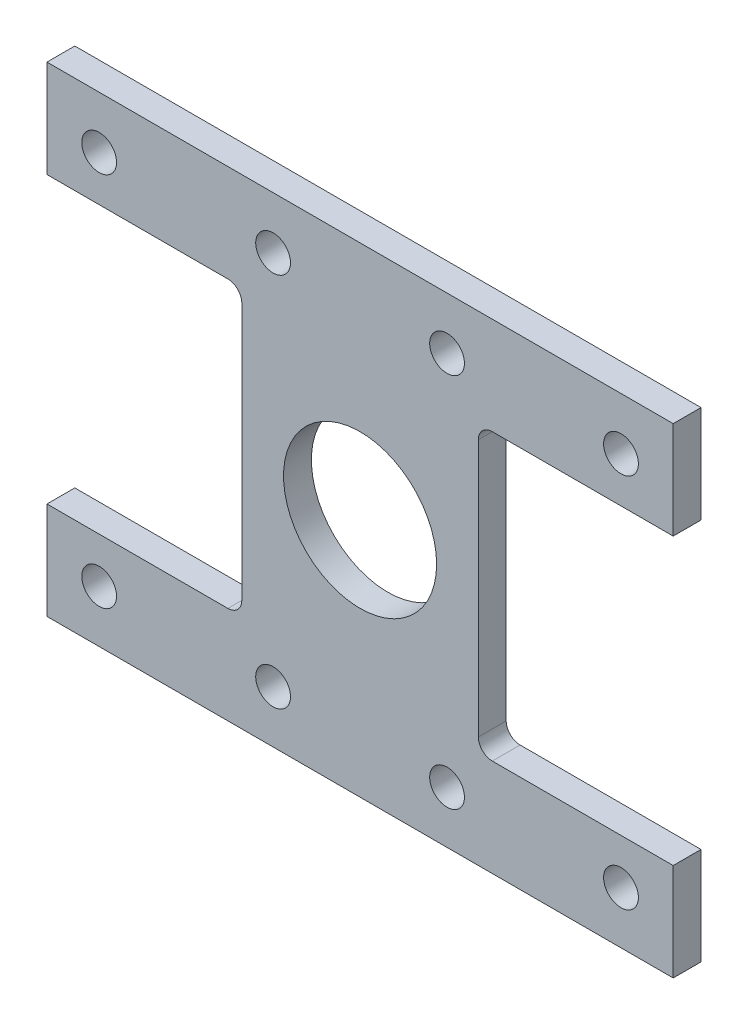
ISO-10303-21;
HEADER;
FILE_DESCRIPTION(('STEP AP214'),'2;1');
FILE_NAME('part.step','',(''),(''),'','','');
FILE_SCHEMA(('AUTOMOTIVE_DESIGN { 1 0 10303 214 1 1 1 1 }'));
ENDSEC;
DATA;
#1=APPLICATION_CONTEXT('core data for automotive mechanical design processes');
#2=APPLICATION_PROTOCOL_DEFINITION('international standard','automotive_design',2000,#1);
#3=PRODUCT_CONTEXT('',#1,'mechanical');
#4=PRODUCT('Part','Part','',(#3));
#5=PRODUCT_RELATED_PRODUCT_CATEGORY('part','',(#4));
#6=PRODUCT_DEFINITION_FORMATION('','',#4);
#7=PRODUCT_DEFINITION_CONTEXT('part definition',#1,'design');
#8=PRODUCT_DEFINITION('design','',#6,#7);
#9=PRODUCT_DEFINITION_SHAPE('','',#8);
#10=(LENGTH_UNIT() NAMED_UNIT(*) SI_UNIT(.MILLI.,.METRE.));
#11=(NAMED_UNIT(*) PLANE_ANGLE_UNIT() SI_UNIT($,.RADIAN.));
#12=(NAMED_UNIT(*) SI_UNIT($,.STERADIAN.) SOLID_ANGLE_UNIT());
#13=UNCERTAINTY_MEASURE_WITH_UNIT(LENGTH_MEASURE(1.E-05),#10,'distance_accuracy_value','');
#14=(GEOMETRIC_REPRESENTATION_CONTEXT(3) GLOBAL_UNCERTAINTY_ASSIGNED_CONTEXT((#13)) GLOBAL_UNIT_ASSIGNED_CONTEXT((#10,
#11,#12)) REPRESENTATION_CONTEXT('',''));
#15=CARTESIAN_POINT('',(0.,0.,0.));
#16=DIRECTION('',(0.,0.,1.));
#17=DIRECTION('',(1.,0.,0.));
#18=AXIS2_PLACEMENT_3D('',#15,#16,#17);
#19=CARTESIAN_POINT('',(45.,0.,4.));
#20=DIRECTION('',(-1.,0.,0.));
#21=DIRECTION('',(0.,0.,1.));
#22=AXIS2_PLACEMENT_3D('',#19,#20,#21);
#23=PLANE('',#22);
#24=DIRECTION('',(0.,1.,0.));
#25=VECTOR('',#24,1.);
#26=CARTESIAN_POINT('',(45.,0.,0.));
#27=LINE('',#26,#25);
#28=CARTESIAN_POINT('',(45.,0.,0.));
#29=VERTEX_POINT('',#28);
#30=CARTESIAN_POINT('',(45.,14.,0.));
#31=VERTEX_POINT('',#30);
#32=EDGE_CURVE('E179',#29,#31,#27,.T.);
#33=ORIENTED_EDGE('',*,*,#32,.T.);
#34=DIRECTION('',(0.,0.,-1.));
#35=VECTOR('',#34,1.);
#36=CARTESIAN_POINT('',(45.,14.,4.));
#37=LINE('',#36,#35);
#38=CARTESIAN_POINT('',(45.,14.,4.));
#39=VERTEX_POINT('',#38);
#40=EDGE_CURVE('E159',#39,#31,#37,.T.);
#41=ORIENTED_EDGE('',*,*,#40,.F.);
#42=DIRECTION('',(0.,1.,0.));
#43=VECTOR('',#42,1.);
#44=CARTESIAN_POINT('',(45.,0.,4.));
#45=LINE('',#44,#43);
#46=CARTESIAN_POINT('',(45.,0.,4.));
#47=VERTEX_POINT('',#46);
#48=EDGE_CURVE('E166',#47,#39,#45,.T.);
#49=ORIENTED_EDGE('',*,*,#48,.F.);
#50=DIRECTION('',(0.,0.,-1.));
#51=VECTOR('',#50,1.);
#52=CARTESIAN_POINT('',(45.,0.,4.));
#53=LINE('',#52,#51);
#54=EDGE_CURVE('E283',#47,#29,#53,.T.);
#55=ORIENTED_EDGE('',*,*,#54,.T.);
#56=EDGE_LOOP('',(#33,#41,#49,#55));
#57=FACE_BOUND('',#56,.T.);
#58=ADVANCED_FACE('F41',(#57),#23,.F.);
#59=CARTESIAN_POINT('',(45.,14.,4.));
#60=DIRECTION('',(0.,-1.,0.));
#61=DIRECTION('',(1.,0.,0.));
#62=AXIS2_PLACEMENT_3D('',#59,#60,#61);
#63=PLANE('',#62);
#64=DIRECTION('',(-1.,0.,0.));
#65=VECTOR('',#64,1.);
#66=CARTESIAN_POINT('',(45.,14.,0.));
#67=LINE('',#66,#65);
#68=CARTESIAN_POINT('',(19.,14.,0.));
#69=VERTEX_POINT('',#68);
#70=EDGE_CURVE('E246',#31,#69,#67,.T.);
#71=ORIENTED_EDGE('',*,*,#70,.T.);
#72=DIRECTION('',(0.,0.,-1.));
#73=VECTOR('',#72,1.);
#74=CARTESIAN_POINT('',(19.,14.,4.));
#75=LINE('',#74,#73);
#76=CARTESIAN_POINT('',(19.,14.,4.));
#77=VERTEX_POINT('',#76);
#78=EDGE_CURVE('E162',#69,#77,#75,.F.);
#79=ORIENTED_EDGE('',*,*,#78,.T.);
#80=DIRECTION('',(-1.,0.,0.));
#81=VECTOR('',#80,1.);
#82=CARTESIAN_POINT('',(45.,14.,4.));
#83=LINE('',#82,#81);
#84=EDGE_CURVE('E154',#39,#77,#83,.T.);
#85=ORIENTED_EDGE('',*,*,#84,.F.);
#86=ORIENTED_EDGE('',*,*,#40,.T.);
#87=EDGE_LOOP('',(#71,#79,#85,#86));
#88=FACE_BOUND('',#87,.T.);
#89=ADVANCED_FACE('F157',(#88),#63,.F.);
#90=CARTESIAN_POINT('',(17.,14.,4.));
#91=DIRECTION('',(-1.,0.,0.));
#92=DIRECTION('',(0.,0.,1.));
#93=AXIS2_PLACEMENT_3D('',#90,#91,#92);
#94=PLANE('',#93);
#95=DIRECTION('',(0.,1.,0.));
#96=VECTOR('',#95,1.);
#97=CARTESIAN_POINT('',(17.,14.,4.));
#98=LINE('',#97,#96);
#99=CARTESIAN_POINT('',(17.,16.,4.));
#100=VERTEX_POINT('',#99);
#101=CARTESIAN_POINT('',(17.,53.,4.));
#102=VERTEX_POINT('',#101);
#103=EDGE_CURVE('E165',#100,#102,#98,.T.);
#104=ORIENTED_EDGE('',*,*,#103,.F.);
#105=DIRECTION('',(0.,0.,-1.));
#106=VECTOR('',#105,1.);
#107=CARTESIAN_POINT('',(17.,16.,0.));
#108=LINE('',#107,#106);
#109=CARTESIAN_POINT('',(17.,16.,0.));
#110=VERTEX_POINT('',#109);
#111=EDGE_CURVE('E203',#100,#110,#108,.T.);
#112=ORIENTED_EDGE('',*,*,#111,.T.);
#113=DIRECTION('',(0.,1.,0.));
#114=VECTOR('',#113,1.);
#115=CARTESIAN_POINT('',(17.,14.,0.));
#116=LINE('',#115,#114);
#117=CARTESIAN_POINT('',(17.,53.,0.));
#118=VERTEX_POINT('',#117);
#119=EDGE_CURVE('E238',#110,#118,#116,.T.);
#120=ORIENTED_EDGE('',*,*,#119,.T.);
#121=DIRECTION('',(0.,0.,-1.));
#122=VECTOR('',#121,1.);
#123=CARTESIAN_POINT('',(17.,53.,4.));
#124=LINE('',#123,#122);
#125=EDGE_CURVE('E200',#118,#102,#124,.F.);
#126=ORIENTED_EDGE('',*,*,#125,.T.);
#127=EDGE_LOOP('',(#104,#112,#120,#126));
#128=FACE_BOUND('',#127,.T.);
#129=ADVANCED_FACE('F243',(#128),#94,.F.);
#130=CARTESIAN_POINT('',(17.,55.,4.));
#131=DIRECTION('',(0.,1.,0.));
#132=DIRECTION('',(-1.,0.,0.));
#133=AXIS2_PLACEMENT_3D('',#130,#131,#132);
#134=PLANE('',#133);
#135=DIRECTION('',(1.,0.,0.));
#136=VECTOR('',#135,1.);
#137=CARTESIAN_POINT('',(17.,55.,4.));
#138=LINE('',#137,#136);
#139=CARTESIAN_POINT('',(19.,55.,4.));
#140=VERTEX_POINT('',#139);
#141=CARTESIAN_POINT('',(45.,55.,4.));
#142=VERTEX_POINT('',#141);
#143=EDGE_CURVE('E251',#140,#142,#138,.T.);
#144=ORIENTED_EDGE('',*,*,#143,.F.);
#145=DIRECTION('',(0.,0.,-1.));
#146=VECTOR('',#145,1.);
#147=CARTESIAN_POINT('',(19.,55.,0.));
#148=LINE('',#147,#146);
#149=CARTESIAN_POINT('',(19.,55.,0.));
#150=VERTEX_POINT('',#149);
#151=EDGE_CURVE('E212',#140,#150,#148,.T.);
#152=ORIENTED_EDGE('',*,*,#151,.T.);
#153=DIRECTION('',(1.,0.,0.));
#154=VECTOR('',#153,1.);
#155=CARTESIAN_POINT('',(17.,55.,0.));
#156=LINE('',#155,#154);
#157=CARTESIAN_POINT('',(45.,55.,0.));
#158=VERTEX_POINT('',#157);
#159=EDGE_CURVE('E240',#150,#158,#156,.T.);
#160=ORIENTED_EDGE('',*,*,#159,.T.);
#161=DIRECTION('',(0.,0.,-1.));
#162=VECTOR('',#161,1.);
#163=CARTESIAN_POINT('',(45.,55.,4.));
#164=LINE('',#163,#162);
#165=EDGE_CURVE('E182',#142,#158,#164,.T.);
#166=ORIENTED_EDGE('',*,*,#165,.F.);
#167=EDGE_LOOP('',(#144,#152,#160,#166));
#168=FACE_BOUND('',#167,.T.);
#169=ADVANCED_FACE('F249',(#168),#134,.F.);
#170=CARTESIAN_POINT('',(45.,55.,4.));
#171=DIRECTION('',(-1.,0.,0.));
#172=DIRECTION('',(0.,0.,1.));
#173=AXIS2_PLACEMENT_3D('',#170,#171,#172);
#174=PLANE('',#173);
#175=DIRECTION('',(0.,1.,0.));
#176=VECTOR('',#175,1.);
#177=CARTESIAN_POINT('',(45.,55.,0.));
#178=LINE('',#177,#176);
#179=CARTESIAN_POINT('',(45.,69.,0.));
#180=VERTEX_POINT('',#179);
#181=EDGE_CURVE('E291',#158,#180,#178,.T.);
#182=ORIENTED_EDGE('',*,*,#181,.T.);
#183=DIRECTION('',(0.,0.,-1.));
#184=VECTOR('',#183,1.);
#185=CARTESIAN_POINT('',(45.,69.,4.));
#186=LINE('',#185,#184);
#187=CARTESIAN_POINT('',(45.,69.,4.));
#188=VERTEX_POINT('',#187);
#189=EDGE_CURVE('E190',#188,#180,#186,.T.);
#190=ORIENTED_EDGE('',*,*,#189,.F.);
#191=DIRECTION('',(0.,1.,0.));
#192=VECTOR('',#191,1.);
#193=CARTESIAN_POINT('',(45.,55.,4.));
#194=LINE('',#193,#192);
#195=EDGE_CURVE('E254',#142,#188,#194,.T.);
#196=ORIENTED_EDGE('',*,*,#195,.F.);
#197=ORIENTED_EDGE('',*,*,#165,.T.);
#198=EDGE_LOOP('',(#182,#190,#196,#197));
#199=FACE_BOUND('',#198,.T.);
#200=ADVANCED_FACE('F398',(#199),#174,.F.);
#201=CARTESIAN_POINT('',(-45.,69.,4.));
#202=DIRECTION('',(0.,-1.,0.));
#203=DIRECTION('',(0.,0.,-1.));
#204=AXIS2_PLACEMENT_3D('',#201,#202,#203);
#205=PLANE('',#204);
#206=DIRECTION('',(-1.,0.,0.));
#207=VECTOR('',#206,1.);
#208=CARTESIAN_POINT('',(-45.,69.,0.));
#209=LINE('',#208,#207);
#210=CARTESIAN_POINT('',(-45.,69.,0.));
#211=VERTEX_POINT('',#210);
#212=EDGE_CURVE('E294',#180,#211,#209,.T.);
#213=ORIENTED_EDGE('',*,*,#212,.T.);
#214=DIRECTION('',(0.,0.,-1.));
#215=VECTOR('',#214,1.);
#216=CARTESIAN_POINT('',(-45.,69.,4.));
#217=LINE('',#216,#215);
#218=CARTESIAN_POINT('',(-45.,69.,4.));
#219=VERTEX_POINT('',#218);
#220=EDGE_CURVE('E330',#219,#211,#217,.T.);
#221=ORIENTED_EDGE('',*,*,#220,.F.);
#222=DIRECTION('',(-1.,0.,0.));
#223=VECTOR('',#222,1.);
#224=CARTESIAN_POINT('',(-45.,69.,4.));
#225=LINE('',#224,#223);
#226=EDGE_CURVE('E258',#188,#219,#225,.T.);
#227=ORIENTED_EDGE('',*,*,#226,.F.);
#228=ORIENTED_EDGE('',*,*,#189,.T.);
#229=EDGE_LOOP('',(#213,#221,#227,#228));
#230=FACE_BOUND('',#229,.T.);
#231=ADVANCED_FACE('F339',(#230),#205,.F.);
#232=CARTESIAN_POINT('',(-45.,55.,4.));
#233=DIRECTION('',(1.,0.,0.));
#234=DIRECTION('',(0.,0.,-1.));
#235=AXIS2_PLACEMENT_3D('',#232,#233,#234);
#236=PLANE('',#235);
#237=DIRECTION('',(0.,-1.,0.));
#238=VECTOR('',#237,1.);
#239=CARTESIAN_POINT('',(-45.,55.,0.));
#240=LINE('',#239,#238);
#241=CARTESIAN_POINT('',(-45.,55.,0.));
#242=VERTEX_POINT('',#241);
#243=EDGE_CURVE('E297',#211,#242,#240,.T.);
#244=ORIENTED_EDGE('',*,*,#243,.T.);
#245=DIRECTION('',(0.,0.,-1.));
#246=VECTOR('',#245,1.);
#247=CARTESIAN_POINT('',(-45.,55.,4.));
#248=LINE('',#247,#246);
#249=CARTESIAN_POINT('',(-45.,55.,4.));
#250=VERTEX_POINT('',#249);
#251=EDGE_CURVE('E326',#250,#242,#248,.T.);
#252=ORIENTED_EDGE('',*,*,#251,.F.);
#253=DIRECTION('',(0.,-1.,0.));
#254=VECTOR('',#253,1.);
#255=CARTESIAN_POINT('',(-45.,55.,4.));
#256=LINE('',#255,#254);
#257=EDGE_CURVE('E264',#219,#250,#256,.T.);
#258=ORIENTED_EDGE('',*,*,#257,.F.);
#259=ORIENTED_EDGE('',*,*,#220,.T.);
#260=EDGE_LOOP('',(#244,#252,#258,#259));
#261=FACE_BOUND('',#260,.T.);
#262=ADVANCED_FACE('F346',(#261),#236,.F.);
#263=CARTESIAN_POINT('',(-17.,55.,4.));
#264=DIRECTION('',(0.,1.,0.));
#265=DIRECTION('',(-1.,0.,0.));
#266=AXIS2_PLACEMENT_3D('',#263,#264,#265);
#267=PLANE('',#266);
#268=DIRECTION('',(1.,0.,0.));
#269=VECTOR('',#268,1.);
#270=CARTESIAN_POINT('',(-17.,55.,0.));
#271=LINE('',#270,#269);
#272=CARTESIAN_POINT('',(-19.,55.,0.));
#273=VERTEX_POINT('',#272);
#274=EDGE_CURVE('E300',#242,#273,#271,.T.);
#275=ORIENTED_EDGE('',*,*,#274,.T.);
#276=DIRECTION('',(0.,0.,-1.));
#277=VECTOR('',#276,1.);
#278=CARTESIAN_POINT('',(-19.,55.,4.));
#279=LINE('',#278,#277);
#280=CARTESIAN_POINT('',(-19.,55.,4.));
#281=VERTEX_POINT('',#280);
#282=EDGE_CURVE('E209',#273,#281,#279,.F.);
#283=ORIENTED_EDGE('',*,*,#282,.T.);
#284=DIRECTION('',(1.,0.,0.));
#285=VECTOR('',#284,1.);
#286=CARTESIAN_POINT('',(-17.,55.,4.));
#287=LINE('',#286,#285);
#288=EDGE_CURVE('E267',#250,#281,#287,.T.);
#289=ORIENTED_EDGE('',*,*,#288,.F.);
#290=ORIENTED_EDGE('',*,*,#251,.T.);
#291=EDGE_LOOP('',(#275,#283,#289,#290));
#292=FACE_BOUND('',#291,.T.);
#293=ADVANCED_FACE('F350',(#292),#267,.F.);
#294=CARTESIAN_POINT('',(-17.,14.,4.));
#295=DIRECTION('',(1.,0.,0.));
#296=DIRECTION('',(0.,0.,-1.));
#297=AXIS2_PLACEMENT_3D('',#294,#295,#296);
#298=PLANE('',#297);
#299=DIRECTION('',(0.,-1.,0.));
#300=VECTOR('',#299,1.);
#301=CARTESIAN_POINT('',(-17.,14.,0.));
#302=LINE('',#301,#300);
#303=CARTESIAN_POINT('',(-17.,53.,0.));
#304=VERTEX_POINT('',#303);
#305=CARTESIAN_POINT('',(-17.,16.,0.));
#306=VERTEX_POINT('',#305);
#307=EDGE_CURVE('E304',#304,#306,#302,.T.);
#308=ORIENTED_EDGE('',*,*,#307,.T.);
#309=DIRECTION('',(0.,0.,-1.));
#310=VECTOR('',#309,1.);
#311=CARTESIAN_POINT('',(-17.,16.,4.));
#312=LINE('',#311,#310);
#313=CARTESIAN_POINT('',(-17.,16.,4.));
#314=VERTEX_POINT('',#313);
#315=EDGE_CURVE('E197',#306,#314,#312,.F.);
#316=ORIENTED_EDGE('',*,*,#315,.T.);
#317=DIRECTION('',(0.,-1.,0.));
#318=VECTOR('',#317,1.);
#319=CARTESIAN_POINT('',(-17.,14.,4.));
#320=LINE('',#319,#318);
#321=CARTESIAN_POINT('',(-17.,53.,4.));
#322=VERTEX_POINT('',#321);
#323=EDGE_CURVE('E271',#322,#314,#320,.T.);
#324=ORIENTED_EDGE('',*,*,#323,.F.);
#325=DIRECTION('',(0.,0.,-1.));
#326=VECTOR('',#325,1.);
#327=CARTESIAN_POINT('',(-17.,53.,0.));
#328=LINE('',#327,#326);
#329=EDGE_CURVE('E187',#322,#304,#328,.T.);
#330=ORIENTED_EDGE('',*,*,#329,.T.);
#331=EDGE_LOOP('',(#308,#316,#324,#330));
#332=FACE_BOUND('',#331,.T.);
#333=ADVANCED_FACE('F359',(#332),#298,.F.);
#334=CARTESIAN_POINT('',(-45.,14.,4.));
#335=DIRECTION('',(0.,-1.,0.));
#336=DIRECTION('',(1.,0.,0.));
#337=AXIS2_PLACEMENT_3D('',#334,#335,#336);
#338=PLANE('',#337);
#339=DIRECTION('',(-1.,0.,0.));
#340=VECTOR('',#339,1.);
#341=CARTESIAN_POINT('',(-45.,14.,4.));
#342=LINE('',#341,#340);
#343=CARTESIAN_POINT('',(-19.,14.,4.));
#344=VERTEX_POINT('',#343);
#345=CARTESIAN_POINT('',(-45.,14.,4.));
#346=VERTEX_POINT('',#345);
#347=EDGE_CURVE('E275',#344,#346,#342,.T.);
#348=ORIENTED_EDGE('',*,*,#347,.F.);
#349=DIRECTION('',(0.,0.,-1.));
#350=VECTOR('',#349,1.);
#351=CARTESIAN_POINT('',(-19.,14.,0.));
#352=LINE('',#351,#350);
#353=CARTESIAN_POINT('',(-19.,14.,0.));
#354=VERTEX_POINT('',#353);
#355=EDGE_CURVE('E181',#344,#354,#352,.T.);
#356=ORIENTED_EDGE('',*,*,#355,.T.);
#357=DIRECTION('',(-1.,0.,0.));
#358=VECTOR('',#357,1.);
#359=CARTESIAN_POINT('',(-45.,14.,0.));
#360=LINE('',#359,#358);
#361=CARTESIAN_POINT('',(-45.,14.,0.));
#362=VERTEX_POINT('',#361);
#363=EDGE_CURVE('E308',#354,#362,#360,.T.);
#364=ORIENTED_EDGE('',*,*,#363,.T.);
#365=DIRECTION('',(0.,0.,-1.));
#366=VECTOR('',#365,1.);
#367=CARTESIAN_POINT('',(-45.,14.,4.));
#368=LINE('',#367,#366);
#369=EDGE_CURVE('E322',#346,#362,#368,.T.);
#370=ORIENTED_EDGE('',*,*,#369,.F.);
#371=EDGE_LOOP('',(#348,#356,#364,#370));
#372=FACE_BOUND('',#371,.T.);
#373=ADVANCED_FACE('F369',(#372),#338,.F.);
#374=CARTESIAN_POINT('',(-45.,0.,4.));
#375=DIRECTION('',(1.,0.,0.));
#376=DIRECTION('',(0.,0.,-1.));
#377=AXIS2_PLACEMENT_3D('',#374,#375,#376);
#378=PLANE('',#377);
#379=DIRECTION('',(0.,-1.,0.));
#380=VECTOR('',#379,1.);
#381=CARTESIAN_POINT('',(-45.,0.,0.));
#382=LINE('',#381,#380);
#383=CARTESIAN_POINT('',(-45.,0.,0.));
#384=VERTEX_POINT('',#383);
#385=EDGE_CURVE('E311',#362,#384,#382,.T.);
#386=ORIENTED_EDGE('',*,*,#385,.T.);
#387=DIRECTION('',(0.,0.,-1.));
#388=VECTOR('',#387,1.);
#389=CARTESIAN_POINT('',(-45.,0.,4.));
#390=LINE('',#389,#388);
#391=CARTESIAN_POINT('',(-45.,0.,4.));
#392=VERTEX_POINT('',#391);
#393=EDGE_CURVE('E318',#392,#384,#390,.T.);
#394=ORIENTED_EDGE('',*,*,#393,.F.);
#395=DIRECTION('',(0.,-1.,0.));
#396=VECTOR('',#395,1.);
#397=CARTESIAN_POINT('',(-45.,0.,4.));
#398=LINE('',#397,#396);
#399=EDGE_CURVE('E278',#346,#392,#398,.T.);
#400=ORIENTED_EDGE('',*,*,#399,.F.);
#401=ORIENTED_EDGE('',*,*,#369,.T.);
#402=EDGE_LOOP('',(#386,#394,#400,#401));
#403=FACE_BOUND('',#402,.T.);
#404=ADVANCED_FACE('F374',(#403),#378,.F.);
#405=CARTESIAN_POINT('',(45.,0.,4.));
#406=DIRECTION('',(0.,1.,0.));
#407=DIRECTION('',(0.,0.,1.));
#408=AXIS2_PLACEMENT_3D('',#405,#406,#407);
#409=PLANE('',#408);
#410=DIRECTION('',(1.,0.,0.));
#411=VECTOR('',#410,1.);
#412=CARTESIAN_POINT('',(45.,0.,0.));
#413=LINE('',#412,#411);
#414=EDGE_CURVE('E176',#384,#29,#413,.T.);
#415=ORIENTED_EDGE('',*,*,#414,.T.);
#416=ORIENTED_EDGE('',*,*,#54,.F.);
#417=DIRECTION('',(1.,0.,0.));
#418=VECTOR('',#417,1.);
#419=CARTESIAN_POINT('',(45.,0.,4.));
#420=LINE('',#419,#418);
#421=EDGE_CURVE('E171',#392,#47,#420,.T.);
#422=ORIENTED_EDGE('',*,*,#421,.F.);
#423=ORIENTED_EDGE('',*,*,#393,.T.);
#424=EDGE_LOOP('',(#415,#416,#422,#423));
#425=FACE_BOUND('',#424,.T.);
#426=ADVANCED_FACE('F377',(#425),#409,.F.);
#427=CARTESIAN_POINT('',(0.,0.,4.));
#428=DIRECTION('',(0.,0.,1.));
#429=DIRECTION('',(1.,0.,0.));
#430=AXIS2_PLACEMENT_3D('',#427,#428,#429);
#431=PLANE('',#430);
#432=CARTESIAN_POINT('',(0.,34.5,4.));
#433=DIRECTION('',(0.,0.,1.));
#434=DIRECTION('',(1.,0.,0.));
#435=AXIS2_PLACEMENT_3D('',#432,#433,#434);
#436=CIRCLE('',#435,11.);
#437=CARTESIAN_POINT('',(11.,34.5,4.));
#438=VERTEX_POINT('',#437);
#439=EDGE_CURVE('E464',#438,#438,#436,.T.);
#440=ORIENTED_EDGE('',*,*,#439,.F.);
#441=EDGE_LOOP('',(#440));
#442=FACE_BOUND('',#441,.T.);
#443=CARTESIAN_POINT('',(-37.5,7.49999999999998,4.));
#444=DIRECTION('',(0.,0.,1.));
#445=DIRECTION('',(1.,0.,0.));
#446=AXIS2_PLACEMENT_3D('',#443,#444,#445);
#447=CIRCLE('',#446,2.5);
#448=CARTESIAN_POINT('',(-35.,7.49999999999998,4.));
#449=VERTEX_POINT('',#448);
#450=EDGE_CURVE('E483',#449,#449,#447,.T.);
#451=ORIENTED_EDGE('',*,*,#450,.F.);
#452=EDGE_LOOP('',(#451));
#453=FACE_BOUND('',#452,.T.);
#454=CARTESIAN_POINT('',(12.5,61.5,4.));
#455=DIRECTION('',(0.,0.,1.));
#456=DIRECTION('',(-1.,0.,0.));
#457=AXIS2_PLACEMENT_3D('',#454,#455,#456);
#458=CIRCLE('',#457,2.5);
#459=CARTESIAN_POINT('',(10.,61.5,4.));
#460=VERTEX_POINT('',#459);
#461=EDGE_CURVE('E500',#460,#460,#458,.T.);
#462=ORIENTED_EDGE('',*,*,#461,.F.);
#463=EDGE_LOOP('',(#462));
#464=FACE_BOUND('',#463,.T.);
#465=CARTESIAN_POINT('',(-12.5,61.5,4.));
#466=DIRECTION('',(0.,0.,1.));
#467=DIRECTION('',(1.,0.,0.));
#468=AXIS2_PLACEMENT_3D('',#465,#466,#467);
#469=CIRCLE('',#468,2.5);
#470=CARTESIAN_POINT('',(-10.,61.5,4.));
#471=VERTEX_POINT('',#470);
#472=EDGE_CURVE('E499',#471,#471,#469,.T.);
#473=ORIENTED_EDGE('',*,*,#472,.F.);
#474=EDGE_LOOP('',(#473));
#475=FACE_BOUND('',#474,.T.);
#476=CARTESIAN_POINT('',(37.5,61.5,4.));
#477=DIRECTION('',(0.,0.,1.));
#478=DIRECTION('',(-1.,0.,0.));
#479=AXIS2_PLACEMENT_3D('',#476,#477,#478);
#480=CIRCLE('',#479,2.5);
#481=CARTESIAN_POINT('',(35.,61.5,4.));
#482=VERTEX_POINT('',#481);
#483=EDGE_CURVE('E516',#482,#482,#480,.T.);
#484=ORIENTED_EDGE('',*,*,#483,.F.);
#485=EDGE_LOOP('',(#484));
#486=FACE_BOUND('',#485,.T.);
#487=CARTESIAN_POINT('',(12.5,7.49999999999998,4.));
#488=DIRECTION('',(0.,0.,1.));
#489=DIRECTION('',(-1.,0.,0.));
#490=AXIS2_PLACEMENT_3D('',#487,#488,#489);
#491=CIRCLE('',#490,2.5);
#492=CARTESIAN_POINT('',(10.,7.49999999999998,4.));
#493=VERTEX_POINT('',#492);
#494=EDGE_CURVE('E468',#493,#493,#491,.T.);
#495=ORIENTED_EDGE('',*,*,#494,.F.);
#496=EDGE_LOOP('',(#495));
#497=FACE_BOUND('',#496,.T.);
#498=CARTESIAN_POINT('',(-12.5,7.49999999999998,4.));
#499=DIRECTION('',(0.,0.,1.));
#500=DIRECTION('',(1.,0.,0.));
#501=AXIS2_PLACEMENT_3D('',#498,#499,#500);
#502=CIRCLE('',#501,2.5);
#503=CARTESIAN_POINT('',(-10.,7.49999999999998,4.));
#504=VERTEX_POINT('',#503);
#505=EDGE_CURVE('E475',#504,#504,#502,.T.);
#506=ORIENTED_EDGE('',*,*,#505,.F.);
#507=EDGE_LOOP('',(#506));
#508=FACE_BOUND('',#507,.T.);
#509=CARTESIAN_POINT('',(37.5,7.49999999999999,4.));
#510=DIRECTION('',(0.,0.,1.));
#511=DIRECTION('',(-1.,0.,0.));
#512=AXIS2_PLACEMENT_3D('',#509,#510,#511);
#513=CIRCLE('',#512,2.5);
#514=CARTESIAN_POINT('',(35.,7.49999999999999,4.));
#515=VERTEX_POINT('',#514);
#516=EDGE_CURVE('E484',#515,#515,#513,.T.);
#517=ORIENTED_EDGE('',*,*,#516,.F.);
#518=EDGE_LOOP('',(#517));
#519=FACE_BOUND('',#518,.T.);
#520=CARTESIAN_POINT('',(-37.5,61.5,4.));
#521=DIRECTION('',(0.,0.,1.));
#522=DIRECTION('',(1.,0.,0.));
#523=AXIS2_PLACEMENT_3D('',#520,#521,#522);
#524=CIRCLE('',#523,2.5);
#525=CARTESIAN_POINT('',(-35.,61.5,4.));
#526=VERTEX_POINT('',#525);
#527=EDGE_CURVE('E515',#526,#526,#524,.T.);
#528=ORIENTED_EDGE('',*,*,#527,.F.);
#529=EDGE_LOOP('',(#528));
#530=FACE_BOUND('',#529,.T.);
#531=ORIENTED_EDGE('',*,*,#48,.T.);
#532=ORIENTED_EDGE('',*,*,#84,.T.);
#533=CARTESIAN_POINT('',(19.,16.,4.));
#534=DIRECTION('',(0.,0.,1.));
#535=DIRECTION('',(1.,0.,0.));
#536=AXIS2_PLACEMENT_3D('',#533,#534,#535);
#537=CIRCLE('',#536,2.);
#538=EDGE_CURVE('E224',#77,#100,#537,.F.);
#539=ORIENTED_EDGE('',*,*,#538,.T.);
#540=ORIENTED_EDGE('',*,*,#103,.T.);
#541=CARTESIAN_POINT('',(19.,53.,4.));
#542=DIRECTION('',(0.,0.,1.));
#543=DIRECTION('',(1.,0.,0.));
#544=AXIS2_PLACEMENT_3D('',#541,#542,#543);
#545=CIRCLE('',#544,2.);
#546=EDGE_CURVE('E11',#102,#140,#545,.F.);
#547=ORIENTED_EDGE('',*,*,#546,.T.);
#548=ORIENTED_EDGE('',*,*,#143,.T.);
#549=ORIENTED_EDGE('',*,*,#195,.T.);
#550=ORIENTED_EDGE('',*,*,#226,.T.);
#551=ORIENTED_EDGE('',*,*,#257,.T.);
#552=ORIENTED_EDGE('',*,*,#288,.T.);
#553=CARTESIAN_POINT('',(-19.,53.,4.));
#554=DIRECTION('',(0.,0.,1.));
#555=DIRECTION('',(1.,0.,0.));
#556=AXIS2_PLACEMENT_3D('',#553,#554,#555);
#557=CIRCLE('',#556,2.);
#558=EDGE_CURVE('E230',#281,#322,#557,.F.);
#559=ORIENTED_EDGE('',*,*,#558,.T.);
#560=ORIENTED_EDGE('',*,*,#323,.T.);
#561=CARTESIAN_POINT('',(-19.,16.,4.));
#562=DIRECTION('',(0.,0.,1.));
#563=DIRECTION('',(1.,0.,0.));
#564=AXIS2_PLACEMENT_3D('',#561,#562,#563);
#565=CIRCLE('',#564,2.);
#566=EDGE_CURVE('E218',#314,#344,#565,.F.);
#567=ORIENTED_EDGE('',*,*,#566,.T.);
#568=ORIENTED_EDGE('',*,*,#347,.T.);
#569=ORIENTED_EDGE('',*,*,#399,.T.);
#570=ORIENTED_EDGE('',*,*,#421,.T.);
#571=EDGE_LOOP('',(#531,#532,#539,#540,#547,#548,#549,#550,#551,#552,#559,#560,#567,#568,#569,#570));
#572=FACE_BOUND('',#571,.T.);
#573=ADVANCED_FACE('F169',(#442,#453,#464,#475,#486,#497,#508,#519,#530,#572),#431,.T.);
#574=CARTESIAN_POINT('',(0.,0.,0.));
#575=DIRECTION('',(0.,0.,1.));
#576=DIRECTION('',(1.,0.,0.));
#577=AXIS2_PLACEMENT_3D('',#574,#575,#576);
#578=PLANE('',#577);
#579=CARTESIAN_POINT('',(0.,34.5,0.));
#580=DIRECTION('',(0.,0.,1.));
#581=DIRECTION('',(1.,0.,0.));
#582=AXIS2_PLACEMENT_3D('',#579,#580,#581);
#583=CIRCLE('',#582,11.);
#584=CARTESIAN_POINT('',(11.,34.5,0.));
#585=VERTEX_POINT('',#584);
#586=EDGE_CURVE('E461',#585,#585,#583,.T.);
#587=ORIENTED_EDGE('',*,*,#586,.T.);
#588=EDGE_LOOP('',(#587));
#589=FACE_BOUND('',#588,.T.);
#590=CARTESIAN_POINT('',(-37.5,7.49999999999998,0.));
#591=DIRECTION('',(0.,0.,1.));
#592=DIRECTION('',(1.,0.,0.));
#593=AXIS2_PLACEMENT_3D('',#590,#591,#592);
#594=CIRCLE('',#593,2.5);
#595=CARTESIAN_POINT('',(-35.,7.49999999999998,0.));
#596=VERTEX_POINT('',#595);
#597=EDGE_CURVE('E504',#596,#596,#594,.T.);
#598=ORIENTED_EDGE('',*,*,#597,.T.);
#599=EDGE_LOOP('',(#598));
#600=FACE_BOUND('',#599,.T.);
#601=CARTESIAN_POINT('',(12.5,61.5,0.));
#602=DIRECTION('',(0.,0.,1.));
#603=DIRECTION('',(-1.,0.,0.));
#604=AXIS2_PLACEMENT_3D('',#601,#602,#603);
#605=CIRCLE('',#604,2.5);
#606=CARTESIAN_POINT('',(10.,61.5,0.));
#607=VERTEX_POINT('',#606);
#608=EDGE_CURVE('E495',#607,#607,#605,.T.);
#609=ORIENTED_EDGE('',*,*,#608,.T.);
#610=EDGE_LOOP('',(#609));
#611=FACE_BOUND('',#610,.T.);
#612=CARTESIAN_POINT('',(-12.5,61.5,0.));
#613=DIRECTION('',(0.,0.,1.));
#614=DIRECTION('',(1.,0.,0.));
#615=AXIS2_PLACEMENT_3D('',#612,#613,#614);
#616=CIRCLE('',#615,2.5);
#617=CARTESIAN_POINT('',(-10.,61.5,0.));
#618=VERTEX_POINT('',#617);
#619=EDGE_CURVE('E520',#618,#618,#616,.T.);
#620=ORIENTED_EDGE('',*,*,#619,.T.);
#621=EDGE_LOOP('',(#620));
#622=FACE_BOUND('',#621,.T.);
#623=CARTESIAN_POINT('',(37.5,61.5,0.));
#624=DIRECTION('',(0.,0.,1.));
#625=DIRECTION('',(-1.,0.,0.));
#626=AXIS2_PLACEMENT_3D('',#623,#624,#625);
#627=CIRCLE('',#626,2.5);
#628=CARTESIAN_POINT('',(35.,61.5,0.));
#629=VERTEX_POINT('',#628);
#630=EDGE_CURVE('E511',#629,#629,#627,.T.);
#631=ORIENTED_EDGE('',*,*,#630,.T.);
#632=EDGE_LOOP('',(#631));
#633=FACE_BOUND('',#632,.T.);
#634=CARTESIAN_POINT('',(12.5,7.49999999999998,0.));
#635=DIRECTION('',(0.,0.,1.));
#636=DIRECTION('',(-1.,0.,0.));
#637=AXIS2_PLACEMENT_3D('',#634,#635,#636);
#638=CIRCLE('',#637,2.5);
#639=CARTESIAN_POINT('',(10.,7.49999999999998,0.));
#640=VERTEX_POINT('',#639);
#641=EDGE_CURVE('E471',#640,#640,#638,.T.);
#642=ORIENTED_EDGE('',*,*,#641,.T.);
#643=EDGE_LOOP('',(#642));
#644=FACE_BOUND('',#643,.T.);
#645=CARTESIAN_POINT('',(-12.5,7.49999999999998,0.));
#646=DIRECTION('',(0.,0.,1.));
#647=DIRECTION('',(1.,0.,0.));
#648=AXIS2_PLACEMENT_3D('',#645,#646,#647);
#649=CIRCLE('',#648,2.5);
#650=CARTESIAN_POINT('',(-10.,7.49999999999998,0.));
#651=VERTEX_POINT('',#650);
#652=EDGE_CURVE('E488',#651,#651,#649,.T.);
#653=ORIENTED_EDGE('',*,*,#652,.T.);
#654=EDGE_LOOP('',(#653));
#655=FACE_BOUND('',#654,.T.);
#656=CARTESIAN_POINT('',(37.5,7.49999999999999,0.));
#657=DIRECTION('',(0.,0.,1.));
#658=DIRECTION('',(-1.,0.,0.));
#659=AXIS2_PLACEMENT_3D('',#656,#657,#658);
#660=CIRCLE('',#659,2.5);
#661=CARTESIAN_POINT('',(35.,7.49999999999999,0.));
#662=VERTEX_POINT('',#661);
#663=EDGE_CURVE('E479',#662,#662,#660,.T.);
#664=ORIENTED_EDGE('',*,*,#663,.T.);
#665=EDGE_LOOP('',(#664));
#666=FACE_BOUND('',#665,.T.);
#667=CARTESIAN_POINT('',(-37.5,61.5,0.));
#668=DIRECTION('',(0.,0.,1.));
#669=DIRECTION('',(1.,0.,0.));
#670=AXIS2_PLACEMENT_3D('',#667,#668,#669);
#671=CIRCLE('',#670,2.5);
#672=CARTESIAN_POINT('',(-35.,61.5,0.));
#673=VERTEX_POINT('',#672);
#674=EDGE_CURVE('E286',#673,#673,#671,.T.);
#675=ORIENTED_EDGE('',*,*,#674,.T.);
#676=EDGE_LOOP('',(#675));
#677=FACE_BOUND('',#676,.T.);
#678=ORIENTED_EDGE('',*,*,#32,.F.);
#679=ORIENTED_EDGE('',*,*,#414,.F.);
#680=ORIENTED_EDGE('',*,*,#385,.F.);
#681=ORIENTED_EDGE('',*,*,#363,.F.);
#682=CARTESIAN_POINT('',(-19.,16.,0.));
#683=DIRECTION('',(0.,0.,1.));
#684=DIRECTION('',(1.,0.,0.));
#685=AXIS2_PLACEMENT_3D('',#682,#683,#684);
#686=CIRCLE('',#685,2.);
#687=EDGE_CURVE('E215',#354,#306,#686,.T.);
#688=ORIENTED_EDGE('',*,*,#687,.T.);
#689=ORIENTED_EDGE('',*,*,#307,.F.);
#690=CARTESIAN_POINT('',(-19.,53.,0.));
#691=DIRECTION('',(0.,0.,1.));
#692=DIRECTION('',(1.,0.,0.));
#693=AXIS2_PLACEMENT_3D('',#690,#691,#692);
#694=CIRCLE('',#693,2.);
#695=EDGE_CURVE('E227',#304,#273,#694,.T.);
#696=ORIENTED_EDGE('',*,*,#695,.T.);
#697=ORIENTED_EDGE('',*,*,#274,.F.);
#698=ORIENTED_EDGE('',*,*,#243,.F.);
#699=ORIENTED_EDGE('',*,*,#212,.F.);
#700=ORIENTED_EDGE('',*,*,#181,.F.);
#701=ORIENTED_EDGE('',*,*,#159,.F.);
#702=CARTESIAN_POINT('',(19.,53.,0.));
#703=DIRECTION('',(0.,0.,1.));
#704=DIRECTION('',(1.,0.,0.));
#705=AXIS2_PLACEMENT_3D('',#702,#703,#704);
#706=CIRCLE('',#705,2.);
#707=EDGE_CURVE('E50',#150,#118,#706,.T.);
#708=ORIENTED_EDGE('',*,*,#707,.T.);
#709=ORIENTED_EDGE('',*,*,#119,.F.);
#710=CARTESIAN_POINT('',(19.,16.,0.));
#711=DIRECTION('',(0.,0.,1.));
#712=DIRECTION('',(1.,0.,0.));
#713=AXIS2_PLACEMENT_3D('',#710,#711,#712);
#714=CIRCLE('',#713,2.);
#715=EDGE_CURVE('E221',#110,#69,#714,.T.);
#716=ORIENTED_EDGE('',*,*,#715,.T.);
#717=ORIENTED_EDGE('',*,*,#70,.F.);
#718=EDGE_LOOP('',(#678,#679,#680,#681,#688,#689,#696,#697,#698,#699,#700,#701,#708,#709,#716,#717));
#719=FACE_BOUND('',#718,.T.);
#720=ADVANCED_FACE('F237',(#589,#600,#611,#622,#633,#644,#655,#666,#677,#719),#578,.F.);
#721=CARTESIAN_POINT('',(-19.,16.,4.));
#722=DIRECTION('',(0.,0.,1.));
#723=DIRECTION('',(1.,0.,0.));
#724=AXIS2_PLACEMENT_3D('',#721,#722,#723);
#725=CYLINDRICAL_SURFACE('',#724,2.);
#726=ORIENTED_EDGE('',*,*,#566,.F.);
#727=ORIENTED_EDGE('',*,*,#315,.F.);
#728=ORIENTED_EDGE('',*,*,#687,.F.);
#729=ORIENTED_EDGE('',*,*,#355,.F.);
#730=EDGE_LOOP('',(#726,#727,#728,#729));
#731=FACE_BOUND('',#730,.T.);
#732=ADVANCED_FACE('F366',(#731),#725,.F.);
#733=CARTESIAN_POINT('',(19.,16.,4.));
#734=DIRECTION('',(0.,0.,1.));
#735=DIRECTION('',(1.,0.,0.));
#736=AXIS2_PLACEMENT_3D('',#733,#734,#735);
#737=CYLINDRICAL_SURFACE('',#736,2.);
#738=ORIENTED_EDGE('',*,*,#538,.F.);
#739=ORIENTED_EDGE('',*,*,#78,.F.);
#740=ORIENTED_EDGE('',*,*,#715,.F.);
#741=ORIENTED_EDGE('',*,*,#111,.F.);
#742=EDGE_LOOP('',(#738,#739,#740,#741));
#743=FACE_BOUND('',#742,.T.);
#744=ADVANCED_FACE('F379',(#743),#737,.F.);
#745=CARTESIAN_POINT('',(-19.,53.,4.));
#746=DIRECTION('',(0.,0.,1.));
#747=DIRECTION('',(1.,0.,0.));
#748=AXIS2_PLACEMENT_3D('',#745,#746,#747);
#749=CYLINDRICAL_SURFACE('',#748,2.);
#750=ORIENTED_EDGE('',*,*,#558,.F.);
#751=ORIENTED_EDGE('',*,*,#282,.F.);
#752=ORIENTED_EDGE('',*,*,#695,.F.);
#753=ORIENTED_EDGE('',*,*,#329,.F.);
#754=EDGE_LOOP('',(#750,#751,#752,#753));
#755=FACE_BOUND('',#754,.T.);
#756=ADVANCED_FACE('F356',(#755),#749,.F.);
#757=CARTESIAN_POINT('',(19.,53.,4.));
#758=DIRECTION('',(0.,0.,1.));
#759=DIRECTION('',(1.,0.,0.));
#760=AXIS2_PLACEMENT_3D('',#757,#758,#759);
#761=CYLINDRICAL_SURFACE('',#760,2.);
#762=ORIENTED_EDGE('',*,*,#546,.F.);
#763=ORIENTED_EDGE('',*,*,#125,.F.);
#764=ORIENTED_EDGE('',*,*,#707,.F.);
#765=ORIENTED_EDGE('',*,*,#151,.F.);
#766=EDGE_LOOP('',(#762,#763,#764,#765));
#767=FACE_BOUND('',#766,.T.);
#768=ADVANCED_FACE('F43',(#767),#761,.F.);
#769=CARTESIAN_POINT('',(-37.5,61.5,0.));
#770=DIRECTION('',(0.,0.,1.));
#771=DIRECTION('',(1.,0.,0.));
#772=AXIS2_PLACEMENT_3D('',#769,#770,#771);
#773=CYLINDRICAL_SURFACE('',#772,2.5);
#774=ORIENTED_EDGE('',*,*,#674,.F.);
#775=EDGE_LOOP('',(#774));
#776=FACE_BOUND('',#775,.T.);
#777=ORIENTED_EDGE('',*,*,#527,.T.);
#778=EDGE_LOOP('',(#777));
#779=FACE_BOUND('',#778,.T.);
#780=ADVANCED_FACE('F421',(#776,#779),#773,.F.);
#781=CARTESIAN_POINT('',(37.5,7.49999999999999,0.));
#782=DIRECTION('',(0.,0.,1.));
#783=DIRECTION('',(1.,0.,0.));
#784=AXIS2_PLACEMENT_3D('',#781,#782,#783);
#785=CYLINDRICAL_SURFACE('',#784,2.5);
#786=ORIENTED_EDGE('',*,*,#663,.F.);
#787=EDGE_LOOP('',(#786));
#788=FACE_BOUND('',#787,.T.);
#789=ORIENTED_EDGE('',*,*,#516,.T.);
#790=EDGE_LOOP('',(#789));
#791=FACE_BOUND('',#790,.T.);
#792=ADVANCED_FACE('F424',(#788,#791),#785,.F.);
#793=CARTESIAN_POINT('',(-12.5,7.49999999999998,0.));
#794=DIRECTION('',(0.,0.,1.));
#795=DIRECTION('',(1.,0.,0.));
#796=AXIS2_PLACEMENT_3D('',#793,#794,#795);
#797=CYLINDRICAL_SURFACE('',#796,2.5);
#798=ORIENTED_EDGE('',*,*,#652,.F.);
#799=EDGE_LOOP('',(#798));
#800=FACE_BOUND('',#799,.T.);
#801=ORIENTED_EDGE('',*,*,#505,.T.);
#802=EDGE_LOOP('',(#801));
#803=FACE_BOUND('',#802,.T.);
#804=ADVANCED_FACE('F444',(#800,#803),#797,.F.);
#805=CARTESIAN_POINT('',(12.5,7.49999999999998,0.));
#806=DIRECTION('',(0.,0.,1.));
#807=DIRECTION('',(1.,0.,0.));
#808=AXIS2_PLACEMENT_3D('',#805,#806,#807);
#809=CYLINDRICAL_SURFACE('',#808,2.5);
#810=ORIENTED_EDGE('',*,*,#641,.F.);
#811=EDGE_LOOP('',(#810));
#812=FACE_BOUND('',#811,.T.);
#813=ORIENTED_EDGE('',*,*,#494,.T.);
#814=EDGE_LOOP('',(#813));
#815=FACE_BOUND('',#814,.T.);
#816=ADVANCED_FACE('F434',(#812,#815),#809,.F.);
#817=CARTESIAN_POINT('',(37.5,61.5,0.));
#818=DIRECTION('',(0.,0.,1.));
#819=DIRECTION('',(1.,0.,0.));
#820=AXIS2_PLACEMENT_3D('',#817,#818,#819);
#821=CYLINDRICAL_SURFACE('',#820,2.5);
#822=ORIENTED_EDGE('',*,*,#630,.F.);
#823=EDGE_LOOP('',(#822));
#824=FACE_BOUND('',#823,.T.);
#825=ORIENTED_EDGE('',*,*,#483,.T.);
#826=EDGE_LOOP('',(#825));
#827=FACE_BOUND('',#826,.T.);
#828=ADVANCED_FACE('F430',(#824,#827),#821,.F.);
#829=CARTESIAN_POINT('',(-12.5,61.5,0.));
#830=DIRECTION('',(0.,0.,1.));
#831=DIRECTION('',(1.,0.,0.));
#832=AXIS2_PLACEMENT_3D('',#829,#830,#831);
#833=CYLINDRICAL_SURFACE('',#832,2.5);
#834=ORIENTED_EDGE('',*,*,#619,.F.);
#835=EDGE_LOOP('',(#834));
#836=FACE_BOUND('',#835,.T.);
#837=ORIENTED_EDGE('',*,*,#472,.T.);
#838=EDGE_LOOP('',(#837));
#839=FACE_BOUND('',#838,.T.);
#840=ADVANCED_FACE('F426',(#836,#839),#833,.F.);
#841=CARTESIAN_POINT('',(12.5,61.5,0.));
#842=DIRECTION('',(0.,0.,1.));
#843=DIRECTION('',(1.,0.,0.));
#844=AXIS2_PLACEMENT_3D('',#841,#842,#843);
#845=CYLINDRICAL_SURFACE('',#844,2.5);
#846=ORIENTED_EDGE('',*,*,#608,.F.);
#847=EDGE_LOOP('',(#846));
#848=FACE_BOUND('',#847,.T.);
#849=ORIENTED_EDGE('',*,*,#461,.T.);
#850=EDGE_LOOP('',(#849));
#851=FACE_BOUND('',#850,.T.);
#852=ADVANCED_FACE('F429',(#848,#851),#845,.F.);
#853=CARTESIAN_POINT('',(-37.5,7.49999999999998,0.));
#854=DIRECTION('',(0.,0.,1.));
#855=DIRECTION('',(1.,0.,0.));
#856=AXIS2_PLACEMENT_3D('',#853,#854,#855);
#857=CYLINDRICAL_SURFACE('',#856,2.5);
#858=ORIENTED_EDGE('',*,*,#597,.F.);
#859=EDGE_LOOP('',(#858));
#860=FACE_BOUND('',#859,.T.);
#861=ORIENTED_EDGE('',*,*,#450,.T.);
#862=EDGE_LOOP('',(#861));
#863=FACE_BOUND('',#862,.T.);
#864=ADVANCED_FACE('F436',(#860,#863),#857,.F.);
#865=CARTESIAN_POINT('',(0.,34.5,0.));
#866=DIRECTION('',(0.,0.,1.));
#867=DIRECTION('',(1.,0.,0.));
#868=AXIS2_PLACEMENT_3D('',#865,#866,#867);
#869=CYLINDRICAL_SURFACE('',#868,11.);
#870=ORIENTED_EDGE('',*,*,#586,.F.);
#871=EDGE_LOOP('',(#870));
#872=FACE_BOUND('',#871,.T.);
#873=ORIENTED_EDGE('',*,*,#439,.T.);
#874=EDGE_LOOP('',(#873));
#875=FACE_BOUND('',#874,.T.);
#876=ADVANCED_FACE('F439',(#872,#875),#869,.F.);
#877=CLOSED_SHELL('',(#58,#89,#129,#169,#200,#231,#262,#293,#333,#373,#404,#426,#573,#720,#732,
#744,#756,#768,#780,#792,#804,#816,#828,#840,#852,#864,#876));
#878=MANIFOLD_SOLID_BREP('B2',#877);
#879=ADVANCED_BREP_SHAPE_REPRESENTATION('',(#18,#878),#14);
#880=SHAPE_DEFINITION_REPRESENTATION(#9,#879);
ENDSEC;
END-ISO-10303-21;
